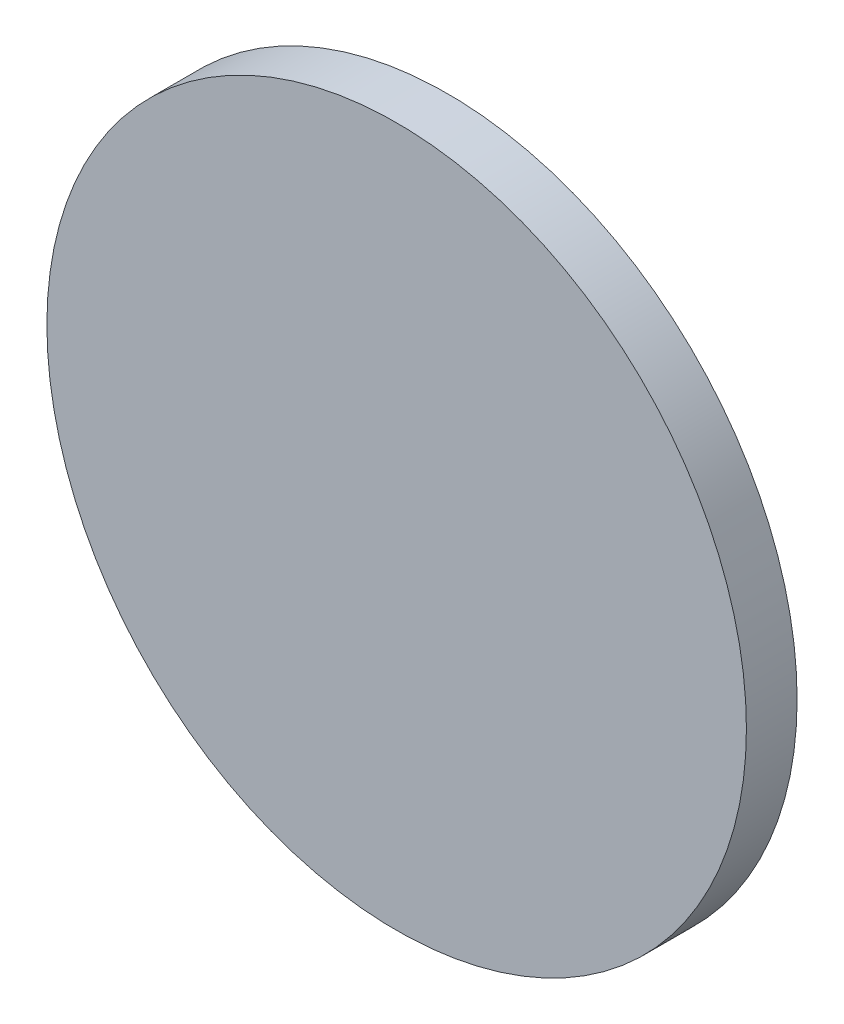
ISO-10303-21;
HEADER;
FILE_DESCRIPTION(('STEP AP214'),'2;1');
FILE_NAME('part.step','',(''),(''),'','','');
FILE_SCHEMA(('AUTOMOTIVE_DESIGN { 1 0 10303 214 1 1 1 1 }'));
ENDSEC;
DATA;
#1=APPLICATION_CONTEXT('core data for automotive mechanical design processes');
#2=APPLICATION_PROTOCOL_DEFINITION('international standard','automotive_design',2000,#1);
#3=PRODUCT_CONTEXT('',#1,'mechanical');
#4=PRODUCT('Part','Part','',(#3));
#5=PRODUCT_RELATED_PRODUCT_CATEGORY('part','',(#4));
#6=PRODUCT_DEFINITION_FORMATION('','',#4);
#7=PRODUCT_DEFINITION_CONTEXT('part definition',#1,'design');
#8=PRODUCT_DEFINITION('design','',#6,#7);
#9=PRODUCT_DEFINITION_SHAPE('','',#8);
#10=(LENGTH_UNIT() NAMED_UNIT(*) SI_UNIT(.MILLI.,.METRE.));
#11=(NAMED_UNIT(*) PLANE_ANGLE_UNIT() SI_UNIT($,.RADIAN.));
#12=(NAMED_UNIT(*) SI_UNIT($,.STERADIAN.) SOLID_ANGLE_UNIT());
#13=UNCERTAINTY_MEASURE_WITH_UNIT(LENGTH_MEASURE(1.E-05),#10,'distance_accuracy_value','');
#14=(GEOMETRIC_REPRESENTATION_CONTEXT(3) GLOBAL_UNCERTAINTY_ASSIGNED_CONTEXT((#13)) GLOBAL_UNIT_ASSIGNED_CONTEXT((#10,
#11,#12)) REPRESENTATION_CONTEXT('',''));
#15=CARTESIAN_POINT('',(0.,0.,0.));
#16=DIRECTION('',(0.,0.,1.));
#17=DIRECTION('',(1.,0.,0.));
#18=AXIS2_PLACEMENT_3D('',#15,#16,#17);
#19=CARTESIAN_POINT('',(0.,0.,3.175));
#20=DIRECTION('',(0.,0.,-1.));
#21=DIRECTION('',(-1.,0.,0.));
#22=AXIS2_PLACEMENT_3D('',#19,#20,#21);
#23=CYLINDRICAL_SURFACE('',#22,21.9075);
#24=CARTESIAN_POINT('',(0.,0.,3.175));
#25=DIRECTION('',(0.,0.,1.));
#26=DIRECTION('',(1.,0.,0.));
#27=AXIS2_PLACEMENT_3D('',#24,#25,#26);
#28=CIRCLE('',#27,21.9075);
#29=CARTESIAN_POINT('',(21.9075,0.,3.175));
#30=VERTEX_POINT('',#29);
#31=EDGE_CURVE('E10',#30,#30,#28,.T.);
#32=ORIENTED_EDGE('',*,*,#31,.F.);
#33=EDGE_LOOP('',(#32));
#34=FACE_BOUND('',#33,.T.);
#35=CARTESIAN_POINT('',(0.,0.,0.));
#36=DIRECTION('',(0.,0.,1.));
#37=DIRECTION('',(1.,0.,0.));
#38=AXIS2_PLACEMENT_3D('',#35,#36,#37);
#39=CIRCLE('',#38,21.9075);
#40=CARTESIAN_POINT('',(21.9075,0.,0.));
#41=VERTEX_POINT('',#40);
#42=EDGE_CURVE('E34',#41,#41,#39,.T.);
#43=ORIENTED_EDGE('',*,*,#42,.T.);
#44=EDGE_LOOP('',(#43));
#45=FACE_BOUND('',#44,.T.);
#46=ADVANCED_FACE('F31',(#34,#45),#23,.T.);
#47=CARTESIAN_POINT('',(0.,0.,3.175));
#48=DIRECTION('',(0.,0.,1.));
#49=DIRECTION('',(1.,0.,0.));
#50=AXIS2_PLACEMENT_3D('',#47,#48,#49);
#51=PLANE('',#50);
#52=ORIENTED_EDGE('',*,*,#31,.T.);
#53=EDGE_LOOP('',(#52));
#54=FACE_BOUND('',#53,.T.);
#55=ADVANCED_FACE('F46',(#54),#51,.T.);
#56=CARTESIAN_POINT('',(0.,0.,0.));
#57=DIRECTION('',(0.,0.,1.));
#58=DIRECTION('',(1.,0.,0.));
#59=AXIS2_PLACEMENT_3D('',#56,#57,#58);
#60=PLANE('',#59);
#61=ORIENTED_EDGE('',*,*,#42,.F.);
#62=EDGE_LOOP('',(#61));
#63=FACE_BOUND('',#62,.T.);
#64=ADVANCED_FACE('F44',(#63),#60,.F.);
#65=CLOSED_SHELL('',(#46,#55,#64));
#66=MANIFOLD_SOLID_BREP('B2',#65);
#67=ADVANCED_BREP_SHAPE_REPRESENTATION('',(#18,#66),#14);
#68=SHAPE_DEFINITION_REPRESENTATION(#9,#67);
ENDSEC;
END-ISO-10303-21;
